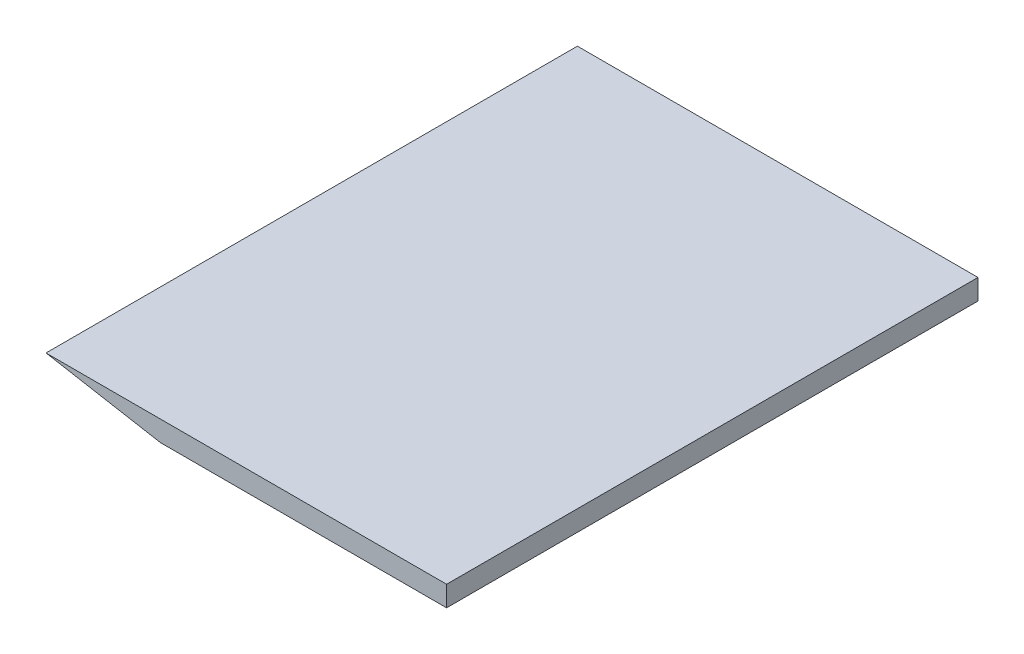
ISO-10303-21;
HEADER;
FILE_DESCRIPTION(('STEP AP214'),'2;1');
FILE_NAME('part.step','',(''),(''),'','','');
FILE_SCHEMA(('AUTOMOTIVE_DESIGN { 1 0 10303 214 1 1 1 1 }'));
ENDSEC;
DATA;
#1=APPLICATION_CONTEXT('core data for automotive mechanical design processes');
#2=APPLICATION_PROTOCOL_DEFINITION('international standard','automotive_design',2000,#1);
#3=PRODUCT_CONTEXT('',#1,'mechanical');
#4=PRODUCT('Part','Part','',(#3));
#5=PRODUCT_RELATED_PRODUCT_CATEGORY('part','',(#4));
#6=PRODUCT_DEFINITION_FORMATION('','',#4);
#7=PRODUCT_DEFINITION_CONTEXT('part definition',#1,'design');
#8=PRODUCT_DEFINITION('design','',#6,#7);
#9=PRODUCT_DEFINITION_SHAPE('','',#8);
#10=(LENGTH_UNIT() NAMED_UNIT(*) SI_UNIT(.MILLI.,.METRE.));
#11=(NAMED_UNIT(*) PLANE_ANGLE_UNIT() SI_UNIT($,.RADIAN.));
#12=(NAMED_UNIT(*) SI_UNIT($,.STERADIAN.) SOLID_ANGLE_UNIT());
#13=UNCERTAINTY_MEASURE_WITH_UNIT(LENGTH_MEASURE(1.E-05),#10,'distance_accuracy_value','');
#14=(GEOMETRIC_REPRESENTATION_CONTEXT(3) GLOBAL_UNCERTAINTY_ASSIGNED_CONTEXT((#13)) GLOBAL_UNIT_ASSIGNED_CONTEXT((#10,
#11,#12)) REPRESENTATION_CONTEXT('',''));
#15=CARTESIAN_POINT('',(0.,0.,0.));
#16=DIRECTION('',(0.,0.,1.));
#17=DIRECTION('',(1.,0.,0.));
#18=AXIS2_PLACEMENT_3D('',#15,#16,#17);
#19=CARTESIAN_POINT('',(28.,-5.,130.));
#20=DIRECTION('',(0.175790638483658,0.984427575508482,0.));
#21=DIRECTION('',(-0.984427575508482,0.175790638483658,0.));
#22=AXIS2_PLACEMENT_3D('',#19,#20,#21);
#23=PLANE('',#22);
#24=DIRECTION('',(0.984427575508482,-0.175790638483658,0.));
#25=VECTOR('',#24,1.);
#26=CARTESIAN_POINT('',(28.,-5.,0.));
#27=LINE('',#26,#25);
#28=CARTESIAN_POINT('',(0.,0.,0.));
#29=VERTEX_POINT('',#28);
#30=CARTESIAN_POINT('',(28.,-5.,0.));
#31=VERTEX_POINT('',#30);
#32=EDGE_CURVE('E107',#29,#31,#27,.T.);
#33=ORIENTED_EDGE('',*,*,#32,.T.);
#34=DIRECTION('',(0.,0.,-1.));
#35=VECTOR('',#34,1.);
#36=CARTESIAN_POINT('',(28.,-5.,130.));
#37=LINE('',#36,#35);
#38=CARTESIAN_POINT('',(28.,-5.,130.));
#39=VERTEX_POINT('',#38);
#40=EDGE_CURVE('E11',#39,#31,#37,.T.);
#41=ORIENTED_EDGE('',*,*,#40,.F.);
#42=DIRECTION('',(0.984427575508482,-0.175790638483658,0.));
#43=VECTOR('',#42,1.);
#44=CARTESIAN_POINT('',(28.,-5.,130.));
#45=LINE('',#44,#43);
#46=CARTESIAN_POINT('',(0.,0.,130.));
#47=VERTEX_POINT('',#46);
#48=EDGE_CURVE('E91',#47,#39,#45,.T.);
#49=ORIENTED_EDGE('',*,*,#48,.F.);
#50=DIRECTION('',(0.,0.,-1.));
#51=VECTOR('',#50,1.);
#52=CARTESIAN_POINT('',(0.,0.,130.));
#53=LINE('',#52,#51);
#54=EDGE_CURVE('E103',#47,#29,#53,.T.);
#55=ORIENTED_EDGE('',*,*,#54,.T.);
#56=EDGE_LOOP('',(#33,#41,#49,#55));
#57=FACE_BOUND('',#56,.T.);
#58=ADVANCED_FACE('F39',(#57),#23,.F.);
#59=CARTESIAN_POINT('',(98.,-5.00000000000003,130.));
#60=DIRECTION('',(0.,1.,0.));
#61=DIRECTION('',(-1.,0.,0.));
#62=AXIS2_PLACEMENT_3D('',#59,#60,#61);
#63=PLANE('',#62);
#64=DIRECTION('',(1.,0.,0.));
#65=VECTOR('',#64,1.);
#66=CARTESIAN_POINT('',(98.,-5.00000000000003,0.));
#67=LINE('',#66,#65);
#68=CARTESIAN_POINT('',(98.,-5.00000000000003,0.));
#69=VERTEX_POINT('',#68);
#70=EDGE_CURVE('E96',#31,#69,#67,.T.);
#71=ORIENTED_EDGE('',*,*,#70,.T.);
#72=DIRECTION('',(0.,0.,-1.));
#73=VECTOR('',#72,1.);
#74=CARTESIAN_POINT('',(98.,-5.00000000000003,130.));
#75=LINE('',#74,#73);
#76=CARTESIAN_POINT('',(98.,-5.00000000000003,130.));
#77=VERTEX_POINT('',#76);
#78=EDGE_CURVE('E48',#77,#69,#75,.T.);
#79=ORIENTED_EDGE('',*,*,#78,.F.);
#80=DIRECTION('',(1.,0.,0.));
#81=VECTOR('',#80,1.);
#82=CARTESIAN_POINT('',(98.,-5.00000000000003,130.));
#83=LINE('',#82,#81);
#84=EDGE_CURVE('E86',#39,#77,#83,.T.);
#85=ORIENTED_EDGE('',*,*,#84,.F.);
#86=ORIENTED_EDGE('',*,*,#40,.T.);
#87=EDGE_LOOP('',(#71,#79,#85,#86));
#88=FACE_BOUND('',#87,.T.);
#89=ADVANCED_FACE('F95',(#88),#63,.F.);
#90=CARTESIAN_POINT('',(98.,0.,130.));
#91=DIRECTION('',(-1.,0.,0.));
#92=DIRECTION('',(0.,0.,1.));
#93=AXIS2_PLACEMENT_3D('',#90,#91,#92);
#94=PLANE('',#93);
#95=DIRECTION('',(0.,1.,0.));
#96=VECTOR('',#95,1.);
#97=CARTESIAN_POINT('',(98.,0.,0.));
#98=LINE('',#97,#96);
#99=CARTESIAN_POINT('',(98.,0.,0.));
#100=VERTEX_POINT('',#99);
#101=EDGE_CURVE('E73',#69,#100,#98,.T.);
#102=ORIENTED_EDGE('',*,*,#101,.T.);
#103=DIRECTION('',(0.,0.,-1.));
#104=VECTOR('',#103,1.);
#105=CARTESIAN_POINT('',(98.,0.,130.));
#106=LINE('',#105,#104);
#107=CARTESIAN_POINT('',(98.,0.,130.));
#108=VERTEX_POINT('',#107);
#109=EDGE_CURVE('E98',#108,#100,#106,.T.);
#110=ORIENTED_EDGE('',*,*,#109,.F.);
#111=DIRECTION('',(0.,1.,0.));
#112=VECTOR('',#111,1.);
#113=CARTESIAN_POINT('',(98.,0.,130.));
#114=LINE('',#113,#112);
#115=EDGE_CURVE('E89',#77,#108,#114,.T.);
#116=ORIENTED_EDGE('',*,*,#115,.F.);
#117=ORIENTED_EDGE('',*,*,#78,.T.);
#118=EDGE_LOOP('',(#102,#110,#116,#117));
#119=FACE_BOUND('',#118,.T.);
#120=ADVANCED_FACE('F99',(#119),#94,.F.);
#121=CARTESIAN_POINT('',(0.,0.,130.));
#122=DIRECTION('',(0.,-1.,0.));
#123=DIRECTION('',(1.,0.,0.));
#124=AXIS2_PLACEMENT_3D('',#121,#122,#123);
#125=PLANE('',#124);
#126=DIRECTION('',(-1.,0.,0.));
#127=VECTOR('',#126,1.);
#128=CARTESIAN_POINT('',(0.,0.,0.));
#129=LINE('',#128,#127);
#130=EDGE_CURVE('E79',#100,#29,#129,.T.);
#131=ORIENTED_EDGE('',*,*,#130,.T.);
#132=ORIENTED_EDGE('',*,*,#54,.F.);
#133=DIRECTION('',(-1.,0.,0.));
#134=VECTOR('',#133,1.);
#135=CARTESIAN_POINT('',(0.,0.,130.));
#136=LINE('',#135,#134);
#137=EDGE_CURVE('E56',#108,#47,#136,.T.);
#138=ORIENTED_EDGE('',*,*,#137,.F.);
#139=ORIENTED_EDGE('',*,*,#109,.T.);
#140=EDGE_LOOP('',(#131,#132,#138,#139));
#141=FACE_BOUND('',#140,.T.);
#142=ADVANCED_FACE('F120',(#141),#125,.F.);
#143=CARTESIAN_POINT('',(0.,0.,130.));
#144=DIRECTION('',(0.,0.,1.));
#145=DIRECTION('',(1.,0.,0.));
#146=AXIS2_PLACEMENT_3D('',#143,#144,#145);
#147=PLANE('',#146);
#148=ORIENTED_EDGE('',*,*,#48,.T.);
#149=ORIENTED_EDGE('',*,*,#84,.T.);
#150=ORIENTED_EDGE('',*,*,#115,.T.);
#151=ORIENTED_EDGE('',*,*,#137,.T.);
#152=EDGE_LOOP('',(#148,#149,#150,#151));
#153=FACE_BOUND('',#152,.T.);
#154=ADVANCED_FACE('F87',(#153),#147,.T.);
#155=CARTESIAN_POINT('',(0.,0.,0.));
#156=DIRECTION('',(0.,0.,1.));
#157=DIRECTION('',(1.,0.,0.));
#158=AXIS2_PLACEMENT_3D('',#155,#156,#157);
#159=PLANE('',#158);
#160=ORIENTED_EDGE('',*,*,#32,.F.);
#161=ORIENTED_EDGE('',*,*,#130,.F.);
#162=ORIENTED_EDGE('',*,*,#101,.F.);
#163=ORIENTED_EDGE('',*,*,#70,.F.);
#164=EDGE_LOOP('',(#160,#161,#162,#163));
#165=FACE_BOUND('',#164,.T.);
#166=ADVANCED_FACE('F123',(#165),#159,.F.);
#167=CLOSED_SHELL('',(#58,#89,#120,#142,#154,#166));
#168=MANIFOLD_SOLID_BREP('B2',#167);
#169=ADVANCED_BREP_SHAPE_REPRESENTATION('',(#18,#168),#14);
#170=SHAPE_DEFINITION_REPRESENTATION(#9,#169);
ENDSEC;
END-ISO-10303-21;
